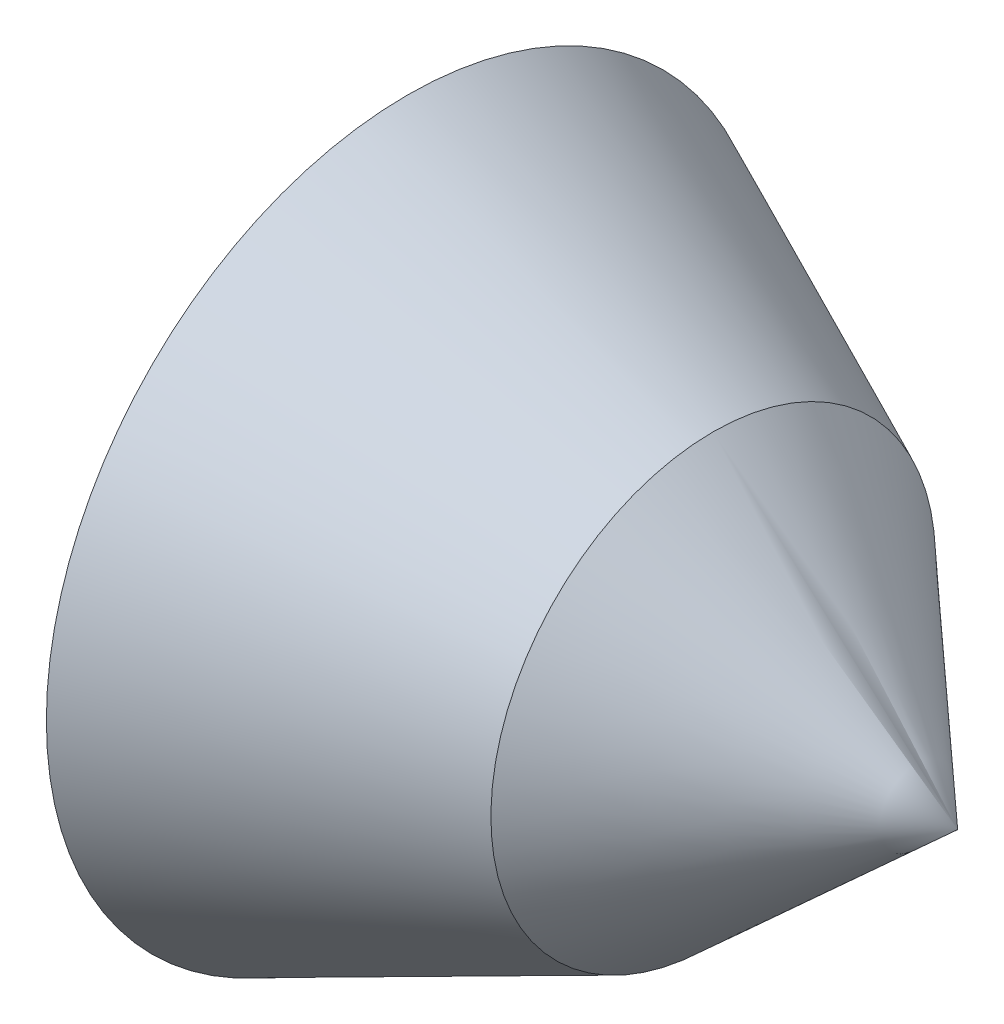
ISO-10303-21;
HEADER;
FILE_DESCRIPTION(('STEP AP214'),'2;1');
FILE_NAME('part.step','',(''),(''),'','','');
FILE_SCHEMA(('AUTOMOTIVE_DESIGN { 1 0 10303 214 1 1 1 1 }'));
ENDSEC;
DATA;
#1=APPLICATION_CONTEXT('core data for automotive mechanical design processes');
#2=APPLICATION_PROTOCOL_DEFINITION('international standard','automotive_design',2000,#1);
#3=PRODUCT_CONTEXT('',#1,'mechanical');
#4=PRODUCT('Part','Part','',(#3));
#5=PRODUCT_RELATED_PRODUCT_CATEGORY('part','',(#4));
#6=PRODUCT_DEFINITION_FORMATION('','',#4);
#7=PRODUCT_DEFINITION_CONTEXT('part definition',#1,'design');
#8=PRODUCT_DEFINITION('design','',#6,#7);
#9=PRODUCT_DEFINITION_SHAPE('','',#8);
#10=(LENGTH_UNIT() NAMED_UNIT(*) SI_UNIT(.MILLI.,.METRE.));
#11=(NAMED_UNIT(*) PLANE_ANGLE_UNIT() SI_UNIT($,.RADIAN.));
#12=(NAMED_UNIT(*) SI_UNIT($,.STERADIAN.) SOLID_ANGLE_UNIT());
#13=UNCERTAINTY_MEASURE_WITH_UNIT(LENGTH_MEASURE(1.E-05),#10,'distance_accuracy_value','');
#14=(GEOMETRIC_REPRESENTATION_CONTEXT(3) GLOBAL_UNCERTAINTY_ASSIGNED_CONTEXT((#13)) GLOBAL_UNIT_ASSIGNED_CONTEXT((#10,
#11,#12)) REPRESENTATION_CONTEXT('',''));
#15=CARTESIAN_POINT('',(0.,0.,0.));
#16=DIRECTION('',(0.,0.,1.));
#17=DIRECTION('',(1.,0.,0.));
#18=AXIS2_PLACEMENT_3D('',#15,#16,#17);
#19=CARTESIAN_POINT('',(7290.,0.,0.));
#20=DIRECTION('',(-1.,0.,0.));
#21=DIRECTION('',(0.,0.,1.));
#22=AXIS2_PLACEMENT_3D('',#19,#20,#21);
#23=CONICAL_SURFACE('',#22,0.,0.737815060120464);
#24=CARTESIAN_POINT('',(6850.,0.,0.));
#25=DIRECTION('',(-1.,0.,0.));
#26=DIRECTION('',(0.,0.,1.));
#27=AXIS2_PLACEMENT_3D('',#24,#25,#26);
#28=CIRCLE('',#27,400.);
#29=CARTESIAN_POINT('',(6850.,400.,-2.87183442387329E-06));
#30=VERTEX_POINT('',#29);
#31=CARTESIAN_POINT('',(6850.,400.,0.));
#32=VERTEX_POINT('',#31);
#33=EDGE_CURVE('E11',#30,#32,#28,.T.);
#34=ORIENTED_EDGE('',*,*,#33,.F.);
#35=DIRECTION('',(-0.739940073395944,0.672672793996312,-4.82951221450409E-09));
#36=VECTOR('',#35,1.);
#37=CARTESIAN_POINT('',(6850.,400.,-2.87183442387329E-06));
#38=LINE('',#37,#36);
#39=CARTESIAN_POINT('',(7290.,0.,0.));
#40=VERTEX_POINT('',#39);
#41=EDGE_CURVE('E80',#40,#30,#38,.T.);
#42=ORIENTED_EDGE('',*,*,#41,.F.);
#43=DIRECTION('',(-0.739940073395944,0.672672793996312,0.));
#44=VECTOR('',#43,1.);
#45=CARTESIAN_POINT('',(6850.,400.,0.));
#46=LINE('',#45,#44);
#47=EDGE_CURVE('E76',#40,#32,#46,.T.);
#48=ORIENTED_EDGE('',*,*,#47,.T.);
#49=EDGE_LOOP('',(#34,#42,#48));
#50=FACE_BOUND('',#49,.T.);
#51=ADVANCED_FACE('F39',(#50),#23,.T.);
#52=CARTESIAN_POINT('',(6850.,0.,0.));
#53=DIRECTION('',(-1.,0.,0.));
#54=DIRECTION('',(0.,0.,1.));
#55=AXIS2_PLACEMENT_3D('',#52,#53,#54);
#56=CONICAL_SURFACE('',#55,400.,0.426627493126876);
#57=CARTESIAN_POINT('',(6300.,0.,0.));
#58=DIRECTION('',(-1.,0.,0.));
#59=DIRECTION('',(0.,0.,1.));
#60=AXIS2_PLACEMENT_3D('',#57,#58,#59);
#61=CIRCLE('',#60,650.);
#62=CARTESIAN_POINT('',(6300.,650.,-4.6667309387941E-06));
#63=VERTEX_POINT('',#62);
#64=CARTESIAN_POINT('',(6300.,650.,0.));
#65=VERTEX_POINT('',#64);
#66=EDGE_CURVE('E46',#63,#65,#61,.T.);
#67=ORIENTED_EDGE('',*,*,#66,.F.);
#68=DIRECTION('',(-0.910366477462605,0.413802944301184,-2.97093385036065E-09));
#69=VECTOR('',#68,1.);
#70=CARTESIAN_POINT('',(6300.,650.,-4.6667309387941E-06));
#71=LINE('',#70,#69);
#72=EDGE_CURVE('E77',#30,#63,#71,.T.);
#73=ORIENTED_EDGE('',*,*,#72,.F.);
#74=ORIENTED_EDGE('',*,*,#33,.T.);
#75=DIRECTION('',(-0.910366477462605,0.413802944301184,0.));
#76=VECTOR('',#75,1.);
#77=CARTESIAN_POINT('',(6300.,650.,0.));
#78=LINE('',#77,#76);
#79=EDGE_CURVE('E73',#32,#65,#78,.T.);
#80=ORIENTED_EDGE('',*,*,#79,.T.);
#81=EDGE_LOOP('',(#67,#73,#74,#80));
#82=FACE_BOUND('',#81,.T.);
#83=ADVANCED_FACE('F72',(#82),#56,.T.);
#84=CARTESIAN_POINT('',(6300.,350.,-2.51285512088913E-06));
#85=DIRECTION('',(1.,0.,0.));
#86=DIRECTION('',(0.,0.,-1.));
#87=AXIS2_PLACEMENT_3D('',#84,#85,#86);
#88=PLANE('',#87);
#89=DIRECTION('',(0.,-1.,7.17958605968322E-09));
#90=VECTOR('',#89,1.);
#91=CARTESIAN_POINT('',(6300.,0.,0.));
#92=LINE('',#91,#90);
#93=CARTESIAN_POINT('',(6300.,0.,0.));
#94=VERTEX_POINT('',#93);
#95=EDGE_CURVE('E52',#63,#94,#92,.T.);
#96=ORIENTED_EDGE('',*,*,#95,.F.);
#97=ORIENTED_EDGE('',*,*,#66,.T.);
#98=DIRECTION('',(0.,-1.,0.));
#99=VECTOR('',#98,1.);
#100=CARTESIAN_POINT('',(6300.,350.,0.));
#101=LINE('',#100,#99);
#102=EDGE_CURVE('E82',#65,#94,#101,.T.);
#103=ORIENTED_EDGE('',*,*,#102,.T.);
#104=EDGE_LOOP('',(#96,#97,#103));
#105=FACE_BOUND('',#104,.T.);
#106=ADVANCED_FACE('F93',(#105),#88,.F.);
#107=CARTESIAN_POINT('',(0.,0.,0.));
#108=DIRECTION('',(0.,7.17958605968322E-09,1.));
#109=DIRECTION('',(1.,0.,0.));
#110=AXIS2_PLACEMENT_3D('',#107,#108,#109);
#111=PLANE('',#110);
#112=ORIENTED_EDGE('',*,*,#95,.T.);
#113=DIRECTION('',(1.,0.,0.));
#114=VECTOR('',#113,1.);
#115=CARTESIAN_POINT('',(7290.,0.,0.));
#116=LINE('',#115,#114);
#117=EDGE_CURVE('E89',#94,#40,#116,.T.);
#118=ORIENTED_EDGE('',*,*,#117,.T.);
#119=ORIENTED_EDGE('',*,*,#41,.T.);
#120=ORIENTED_EDGE('',*,*,#72,.T.);
#121=EDGE_LOOP('',(#112,#118,#119,#120));
#122=FACE_BOUND('',#121,.T.);
#123=ADVANCED_FACE('F94',(#122),#111,.T.);
#124=CARTESIAN_POINT('',(0.,0.,0.));
#125=DIRECTION('',(0.,0.,1.));
#126=DIRECTION('',(1.,0.,0.));
#127=AXIS2_PLACEMENT_3D('',#124,#125,#126);
#128=PLANE('',#127);
#129=ORIENTED_EDGE('',*,*,#117,.F.);
#130=ORIENTED_EDGE('',*,*,#102,.F.);
#131=ORIENTED_EDGE('',*,*,#79,.F.);
#132=ORIENTED_EDGE('',*,*,#47,.F.);
#133=EDGE_LOOP('',(#129,#130,#131,#132));
#134=FACE_BOUND('',#133,.T.);
#135=ADVANCED_FACE('F84',(#134),#128,.F.);
#136=CLOSED_SHELL('',(#51,#83,#106,#123,#135));
#137=MANIFOLD_SOLID_BREP('B2',#136);
#138=ADVANCED_BREP_SHAPE_REPRESENTATION('',(#18,#137),#14);
#139=SHAPE_DEFINITION_REPRESENTATION(#9,#138);
ENDSEC;
END-ISO-10303-21;
